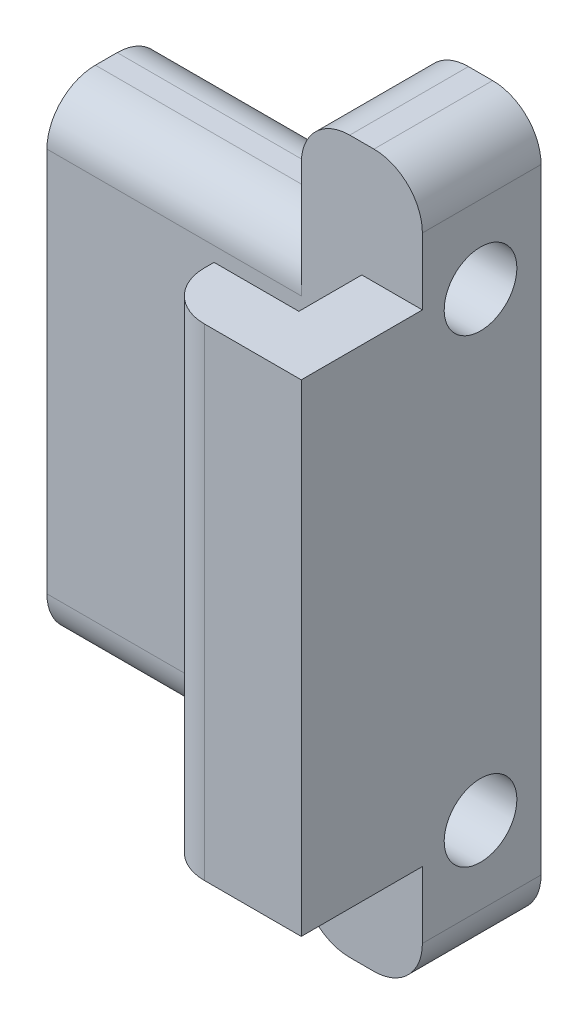
ISO-10303-21;
HEADER;
FILE_DESCRIPTION(('STEP AP214'),'2;1');
FILE_NAME('part.step','',(''),(''),'','','');
FILE_SCHEMA(('AUTOMOTIVE_DESIGN { 1 0 10303 214 1 1 1 1 }'));
ENDSEC;
DATA;
#1=APPLICATION_CONTEXT('core data for automotive mechanical design processes');
#2=APPLICATION_PROTOCOL_DEFINITION('international standard','automotive_design',2000,#1);
#3=PRODUCT_CONTEXT('',#1,'mechanical');
#4=PRODUCT('Part','Part','',(#3));
#5=PRODUCT_RELATED_PRODUCT_CATEGORY('part','',(#4));
#6=PRODUCT_DEFINITION_FORMATION('','',#4);
#7=PRODUCT_DEFINITION_CONTEXT('part definition',#1,'design');
#8=PRODUCT_DEFINITION('design','',#6,#7);
#9=PRODUCT_DEFINITION_SHAPE('','',#8);
#10=(LENGTH_UNIT() NAMED_UNIT(*) SI_UNIT(.MILLI.,.METRE.));
#11=(NAMED_UNIT(*) PLANE_ANGLE_UNIT() SI_UNIT($,.RADIAN.));
#12=(NAMED_UNIT(*) SI_UNIT($,.STERADIAN.) SOLID_ANGLE_UNIT());
#13=UNCERTAINTY_MEASURE_WITH_UNIT(LENGTH_MEASURE(1.E-05),#10,'distance_accuracy_value','');
#14=(GEOMETRIC_REPRESENTATION_CONTEXT(3) GLOBAL_UNCERTAINTY_ASSIGNED_CONTEXT((#13)) GLOBAL_UNIT_ASSIGNED_CONTEXT((#10,
#11,#12)) REPRESENTATION_CONTEXT('',''));
#15=CARTESIAN_POINT('',(0.,0.,0.));
#16=DIRECTION('',(0.,0.,1.));
#17=DIRECTION('',(1.,0.,0.));
#18=AXIS2_PLACEMENT_3D('',#15,#16,#17);
#19=CARTESIAN_POINT('',(10.5,19.9,4.9));
#20=DIRECTION('',(1.,0.,0.));
#21=DIRECTION('',(0.,0.,-1.));
#22=AXIS2_PLACEMENT_3D('',#19,#20,#21);
#23=PLANE('',#22);
#24=DIRECTION('',(0.,-1.,0.));
#25=VECTOR('',#24,1.);
#26=CARTESIAN_POINT('',(10.5,-4.75,0.));
#27=LINE('',#26,#25);
#28=CARTESIAN_POINT('',(10.5,2.,0.));
#29=VERTEX_POINT('',#28);
#30=CARTESIAN_POINT('',(10.5,-2.75,0.));
#31=VERTEX_POINT('',#30);
#32=EDGE_CURVE('E252',#29,#31,#27,.T.);
#33=ORIENTED_EDGE('',*,*,#32,.T.);
#34=DIRECTION('',(0.,0.,-1.));
#35=VECTOR('',#34,1.);
#36=CARTESIAN_POINT('',(10.5,-2.75,4.9));
#37=LINE('',#36,#35);
#38=CARTESIAN_POINT('',(10.5,-2.75,4.9));
#39=VERTEX_POINT('',#38);
#40=EDGE_CURVE('E371',#31,#39,#37,.F.);
#41=ORIENTED_EDGE('',*,*,#40,.T.);
#42=DIRECTION('',(0.,-1.,0.));
#43=VECTOR('',#42,1.);
#44=CARTESIAN_POINT('',(10.5,-4.75,4.9));
#45=LINE('',#44,#43);
#46=CARTESIAN_POINT('',(10.5,2.,4.9));
#47=VERTEX_POINT('',#46);
#48=EDGE_CURVE('E261',#47,#39,#45,.T.);
#49=ORIENTED_EDGE('',*,*,#48,.F.);
#50=CARTESIAN_POINT('',(10.5,2.,2.9));
#51=DIRECTION('',(1.,0.,0.));
#52=DIRECTION('',(0.,0.,-1.));
#53=AXIS2_PLACEMENT_3D('',#50,#51,#52);
#54=CIRCLE('',#53,2.);
#55=CARTESIAN_POINT('',(10.5,0.,2.9));
#56=VERTEX_POINT('',#55);
#57=EDGE_CURVE('E335',#47,#56,#54,.T.);
#58=ORIENTED_EDGE('',*,*,#57,.T.);
#59=DIRECTION('',(0.,0.,-1.));
#60=VECTOR('',#59,1.);
#61=CARTESIAN_POINT('',(10.5,0.,4.9));
#62=LINE('',#61,#60);
#63=CARTESIAN_POINT('',(10.5,0.,2.));
#64=VERTEX_POINT('',#63);
#65=EDGE_CURVE('E303',#56,#64,#62,.T.);
#66=ORIENTED_EDGE('',*,*,#65,.T.);
#67=CARTESIAN_POINT('',(10.5,2.,2.));
#68=DIRECTION('',(1.,0.,0.));
#69=DIRECTION('',(0.,0.,-1.));
#70=AXIS2_PLACEMENT_3D('',#67,#68,#69);
#71=CIRCLE('',#70,2.);
#72=EDGE_CURVE('E337',#64,#29,#71,.T.);
#73=ORIENTED_EDGE('',*,*,#72,.T.);
#74=EDGE_LOOP('',(#33,#41,#49,#58,#66,#73));
#75=FACE_BOUND('',#74,.T.);
#76=ADVANCED_FACE('F41',(#75),#23,.F.);
#77=DIRECTION('',(0.,-1.,0.));
#78=VECTOR('',#77,1.);
#79=CARTESIAN_POINT('',(10.5,19.9,4.9));
#80=LINE('',#79,#78);
#81=CARTESIAN_POINT('',(10.5,22.65,4.9));
#82=VERTEX_POINT('',#81);
#83=CARTESIAN_POINT('',(10.5,17.9,4.9));
#84=VERTEX_POINT('',#83);
#85=EDGE_CURVE('E274',#82,#84,#80,.T.);
#86=ORIENTED_EDGE('',*,*,#85,.F.);
#87=DIRECTION('',(0.,0.,-1.));
#88=VECTOR('',#87,1.);
#89=CARTESIAN_POINT('',(10.5,22.65,4.9));
#90=LINE('',#89,#88);
#91=CARTESIAN_POINT('',(10.5,22.65,0.));
#92=VERTEX_POINT('',#91);
#93=EDGE_CURVE('E373',#82,#92,#90,.T.);
#94=ORIENTED_EDGE('',*,*,#93,.T.);
#95=DIRECTION('',(0.,-1.,0.));
#96=VECTOR('',#95,1.);
#97=CARTESIAN_POINT('',(10.5,19.9,0.));
#98=LINE('',#97,#96);
#99=CARTESIAN_POINT('',(10.5,17.9,0.));
#100=VERTEX_POINT('',#99);
#101=EDGE_CURVE('E291',#92,#100,#98,.T.);
#102=ORIENTED_EDGE('',*,*,#101,.T.);
#103=CARTESIAN_POINT('',(10.5,17.9,2.));
#104=DIRECTION('',(1.,0.,0.));
#105=DIRECTION('',(0.,0.,-1.));
#106=AXIS2_PLACEMENT_3D('',#103,#104,#105);
#107=CIRCLE('',#106,2.);
#108=CARTESIAN_POINT('',(10.5,19.9,2.));
#109=VERTEX_POINT('',#108);
#110=EDGE_CURVE('E340',#100,#109,#107,.T.);
#111=ORIENTED_EDGE('',*,*,#110,.T.);
#112=DIRECTION('',(0.,0.,-1.));
#113=VECTOR('',#112,1.);
#114=CARTESIAN_POINT('',(10.5,19.9,4.9));
#115=LINE('',#114,#113);
#116=CARTESIAN_POINT('',(10.5,19.9,2.9));
#117=VERTEX_POINT('',#116);
#118=EDGE_CURVE('E300',#117,#109,#115,.T.);
#119=ORIENTED_EDGE('',*,*,#118,.F.);
#120=CARTESIAN_POINT('',(10.5,17.9,2.9));
#121=DIRECTION('',(1.,0.,0.));
#122=DIRECTION('',(0.,0.,-1.));
#123=AXIS2_PLACEMENT_3D('',#120,#121,#122);
#124=CIRCLE('',#123,2.);
#125=EDGE_CURVE('E342',#117,#84,#124,.T.);
#126=ORIENTED_EDGE('',*,*,#125,.T.);
#127=EDGE_LOOP('',(#86,#94,#102,#111,#119,#126));
#128=FACE_BOUND('',#127,.T.);
#129=ADVANCED_FACE('F399',(#128),#23,.F.);
#130=CARTESIAN_POINT('',(0.,0.,4.9));
#131=DIRECTION('',(0.,0.,-1.));
#132=DIRECTION('',(-1.,0.,0.));
#133=AXIS2_PLACEMENT_3D('',#130,#131,#132);
#134=PLANE('',#133);
#135=DIRECTION('',(1.,0.,0.));
#136=VECTOR('',#135,1.);
#137=CARTESIAN_POINT('',(15.5,-4.75,4.9));
#138=LINE('',#137,#136);
#139=CARTESIAN_POINT('',(12.5,-4.75,4.9));
#140=VERTEX_POINT('',#139);
#141=CARTESIAN_POINT('',(13.5,-4.75,4.9));
#142=VERTEX_POINT('',#141);
#143=EDGE_CURVE('E264',#140,#142,#138,.T.);
#144=ORIENTED_EDGE('',*,*,#143,.T.);
#145=CARTESIAN_POINT('',(13.5,-2.75,4.9));
#146=DIRECTION('',(0.,0.,-1.));
#147=DIRECTION('',(-1.,0.,0.));
#148=AXIS2_PLACEMENT_3D('',#145,#146,#147);
#149=CIRCLE('',#148,2.);
#150=CARTESIAN_POINT('',(15.5,-2.75,4.9));
#151=VERTEX_POINT('',#150);
#152=EDGE_CURVE('E369',#142,#151,#149,.F.);
#153=ORIENTED_EDGE('',*,*,#152,.T.);
#154=DIRECTION('',(0.,1.,0.));
#155=VECTOR('',#154,1.);
#156=CARTESIAN_POINT('',(15.5,24.65,4.9));
#157=LINE('',#156,#155);
#158=CARTESIAN_POINT('',(15.5,0.,4.9));
#159=VERTEX_POINT('',#158);
#160=EDGE_CURVE('E269',#151,#159,#157,.T.);
#161=ORIENTED_EDGE('',*,*,#160,.T.);
#162=DIRECTION('',(1.,0.,0.));
#163=VECTOR('',#162,1.);
#164=CARTESIAN_POINT('',(10.5,0.,4.9));
#165=LINE('',#164,#163);
#166=CARTESIAN_POINT('',(13.,0.,4.9));
#167=VERTEX_POINT('',#166);
#168=EDGE_CURVE('E231',#167,#159,#165,.T.);
#169=ORIENTED_EDGE('',*,*,#168,.F.);
#170=DIRECTION('',(0.,1.,0.));
#171=VECTOR('',#170,1.);
#172=CARTESIAN_POINT('',(13.,-4.75,4.9));
#173=LINE('',#172,#171);
#174=CARTESIAN_POINT('',(13.,19.9,4.9));
#175=VERTEX_POINT('',#174);
#176=EDGE_CURVE('E224',#167,#175,#173,.T.);
#177=ORIENTED_EDGE('',*,*,#176,.T.);
#178=DIRECTION('',(-1.,0.,0.));
#179=VECTOR('',#178,1.);
#180=CARTESIAN_POINT('',(10.5,19.9,4.9));
#181=LINE('',#180,#179);
#182=CARTESIAN_POINT('',(15.5,19.9,4.9));
#183=VERTEX_POINT('',#182);
#184=EDGE_CURVE('E235',#183,#175,#181,.T.);
#185=ORIENTED_EDGE('',*,*,#184,.F.);
#186=CARTESIAN_POINT('',(15.5,22.65,4.9));
#187=VERTEX_POINT('',#186);
#188=EDGE_CURVE('E268',#183,#187,#157,.T.);
#189=ORIENTED_EDGE('',*,*,#188,.T.);
#190=CARTESIAN_POINT('',(13.5,22.65,4.9));
#191=DIRECTION('',(0.,0.,-1.));
#192=DIRECTION('',(-1.,0.,0.));
#193=AXIS2_PLACEMENT_3D('',#190,#191,#192);
#194=CIRCLE('',#193,2.);
#195=CARTESIAN_POINT('',(13.5,24.65,4.9));
#196=VERTEX_POINT('',#195);
#197=EDGE_CURVE('E363',#187,#196,#194,.F.);
#198=ORIENTED_EDGE('',*,*,#197,.T.);
#199=DIRECTION('',(-1.,0.,0.));
#200=VECTOR('',#199,1.);
#201=CARTESIAN_POINT('',(10.5,24.65,4.9));
#202=LINE('',#201,#200);
#203=CARTESIAN_POINT('',(12.5,24.65,4.9));
#204=VERTEX_POINT('',#203);
#205=EDGE_CURVE('E271',#196,#204,#202,.T.);
#206=ORIENTED_EDGE('',*,*,#205,.T.);
#207=CARTESIAN_POINT('',(12.5,22.65,4.9));
#208=DIRECTION('',(0.,0.,-1.));
#209=DIRECTION('',(-1.,0.,0.));
#210=AXIS2_PLACEMENT_3D('',#207,#208,#209);
#211=CIRCLE('',#210,2.);
#212=EDGE_CURVE('E365',#204,#82,#211,.F.);
#213=ORIENTED_EDGE('',*,*,#212,.T.);
#214=ORIENTED_EDGE('',*,*,#85,.T.);
#215=DIRECTION('',(-1.,0.,0.));
#216=VECTOR('',#215,1.);
#217=CARTESIAN_POINT('',(0.,17.9,4.9));
#218=LINE('',#217,#216);
#219=CARTESIAN_POINT('',(0.,17.9,4.9));
#220=VERTEX_POINT('',#219);
#221=EDGE_CURVE('E306',#84,#220,#218,.T.);
#222=ORIENTED_EDGE('',*,*,#221,.T.);
#223=DIRECTION('',(0.,-1.,0.));
#224=VECTOR('',#223,1.);
#225=CARTESIAN_POINT('',(0.,0.,4.9));
#226=LINE('',#225,#224);
#227=CARTESIAN_POINT('',(0.,2.,4.9));
#228=VERTEX_POINT('',#227);
#229=EDGE_CURVE('E276',#220,#228,#226,.T.);
#230=ORIENTED_EDGE('',*,*,#229,.T.);
#231=DIRECTION('',(1.,0.,0.));
#232=VECTOR('',#231,1.);
#233=CARTESIAN_POINT('',(0.,2.,4.9));
#234=LINE('',#233,#232);
#235=EDGE_CURVE('E309',#228,#47,#234,.T.);
#236=ORIENTED_EDGE('',*,*,#235,.T.);
#237=ORIENTED_EDGE('',*,*,#48,.T.);
#238=CARTESIAN_POINT('',(12.5,-2.75,4.9));
#239=DIRECTION('',(0.,0.,-1.));
#240=DIRECTION('',(-1.,0.,0.));
#241=AXIS2_PLACEMENT_3D('',#238,#239,#240);
#242=CIRCLE('',#241,2.);
#243=EDGE_CURVE('E367',#39,#140,#242,.F.);
#244=ORIENTED_EDGE('',*,*,#243,.T.);
#245=EDGE_LOOP('',(#144,#153,#161,#169,#177,#185,#189,#198,#206,#213,#214,#222,#230,#236,#237,#244));
#246=FACE_BOUND('',#245,.T.);
#247=ADVANCED_FACE('F391',(#246),#134,.F.);
#248=CARTESIAN_POINT('',(10.5,0.,4.9));
#249=DIRECTION('',(0.,1.,0.));
#250=DIRECTION('',(-1.,0.,0.));
#251=AXIS2_PLACEMENT_3D('',#248,#249,#250);
#252=PLANE('',#251);
#253=ORIENTED_EDGE('',*,*,#65,.F.);
#254=DIRECTION('',(1.,0.,0.));
#255=VECTOR('',#254,1.);
#256=CARTESIAN_POINT('',(10.5,0.,2.9));
#257=LINE('',#256,#255);
#258=CARTESIAN_POINT('',(0.,0.,2.9));
#259=VERTEX_POINT('',#258);
#260=EDGE_CURVE('E315',#56,#259,#257,.F.);
#261=ORIENTED_EDGE('',*,*,#260,.T.);
#262=DIRECTION('',(0.,0.,-1.));
#263=VECTOR('',#262,1.);
#264=CARTESIAN_POINT('',(0.,0.,4.9));
#265=LINE('',#264,#263);
#266=CARTESIAN_POINT('',(0.,0.,2.));
#267=VERTEX_POINT('',#266);
#268=EDGE_CURVE('E279',#259,#267,#265,.T.);
#269=ORIENTED_EDGE('',*,*,#268,.T.);
#270=DIRECTION('',(1.,0.,0.));
#271=VECTOR('',#270,1.);
#272=CARTESIAN_POINT('',(10.5,0.,2.));
#273=LINE('',#272,#271);
#274=EDGE_CURVE('E312',#267,#64,#273,.T.);
#275=ORIENTED_EDGE('',*,*,#274,.T.);
#276=EDGE_LOOP('',(#253,#261,#269,#275));
#277=FACE_BOUND('',#276,.T.);
#278=ADVANCED_FACE('F480',(#277),#252,.F.);
#279=CARTESIAN_POINT('',(15.5,-4.75,4.9));
#280=DIRECTION('',(0.,1.,0.));
#281=DIRECTION('',(-1.,0.,0.));
#282=AXIS2_PLACEMENT_3D('',#279,#280,#281);
#283=PLANE('',#282);
#284=DIRECTION('',(1.,0.,0.));
#285=VECTOR('',#284,1.);
#286=CARTESIAN_POINT('',(15.5,-4.75,0.));
#287=LINE('',#286,#285);
#288=CARTESIAN_POINT('',(12.5,-4.75,0.));
#289=VERTEX_POINT('',#288);
#290=CARTESIAN_POINT('',(13.5,-4.75,0.));
#291=VERTEX_POINT('',#290);
#292=EDGE_CURVE('E282',#289,#291,#287,.T.);
#293=ORIENTED_EDGE('',*,*,#292,.T.);
#294=DIRECTION('',(0.,0.,-1.));
#295=VECTOR('',#294,1.);
#296=CARTESIAN_POINT('',(13.5,-4.75,4.9));
#297=LINE('',#296,#295);
#298=EDGE_CURVE('E361',#291,#142,#297,.F.);
#299=ORIENTED_EDGE('',*,*,#298,.T.);
#300=ORIENTED_EDGE('',*,*,#143,.F.);
#301=DIRECTION('',(0.,0.,-1.));
#302=VECTOR('',#301,1.);
#303=CARTESIAN_POINT('',(12.5,-4.75,4.9));
#304=LINE('',#303,#302);
#305=EDGE_CURVE('E358',#140,#289,#304,.T.);
#306=ORIENTED_EDGE('',*,*,#305,.T.);
#307=EDGE_LOOP('',(#293,#299,#300,#306));
#308=FACE_BOUND('',#307,.T.);
#309=ADVANCED_FACE('F437',(#308),#283,.F.);
#310=CARTESIAN_POINT('',(15.5,24.65,4.9));
#311=DIRECTION('',(-1.,0.,0.));
#312=DIRECTION('',(0.,-1.,0.));
#313=AXIS2_PLACEMENT_3D('',#310,#311,#312);
#314=PLANE('',#313);
#315=CARTESIAN_POINT('',(15.5,19.45,2.5));
#316=DIRECTION('',(1.,0.,0.));
#317=DIRECTION('',(0.,1.,0.));
#318=AXIS2_PLACEMENT_3D('',#315,#316,#317);
#319=CIRCLE('',#318,1.5);
#320=CARTESIAN_POINT('',(15.5,20.95,2.5));
#321=VERTEX_POINT('',#320);
#322=EDGE_CURVE('E253',#321,#321,#319,.T.);
#323=ORIENTED_EDGE('',*,*,#322,.F.);
#324=EDGE_LOOP('',(#323));
#325=FACE_BOUND('',#324,.T.);
#326=CARTESIAN_POINT('',(15.5,0.450000000000001,2.5));
#327=DIRECTION('',(1.,0.,0.));
#328=DIRECTION('',(0.,-1.,0.));
#329=AXIS2_PLACEMENT_3D('',#326,#327,#328);
#330=CIRCLE('',#329,1.5);
#331=CARTESIAN_POINT('',(15.5,-1.05,2.5));
#332=VERTEX_POINT('',#331);
#333=EDGE_CURVE('E256',#332,#332,#330,.T.);
#334=ORIENTED_EDGE('',*,*,#333,.F.);
#335=EDGE_LOOP('',(#334));
#336=FACE_BOUND('',#335,.T.);
#337=ORIENTED_EDGE('',*,*,#160,.F.);
#338=DIRECTION('',(0.,0.,-1.));
#339=VECTOR('',#338,1.);
#340=CARTESIAN_POINT('',(15.5,-2.75,4.9));
#341=LINE('',#340,#339);
#342=CARTESIAN_POINT('',(15.5,-2.75,0.));
#343=VERTEX_POINT('',#342);
#344=EDGE_CURVE('E347',#151,#343,#341,.T.);
#345=ORIENTED_EDGE('',*,*,#344,.T.);
#346=DIRECTION('',(0.,1.,0.));
#347=VECTOR('',#346,1.);
#348=CARTESIAN_POINT('',(15.5,24.65,0.));
#349=LINE('',#348,#347);
#350=CARTESIAN_POINT('',(15.5,22.65,0.));
#351=VERTEX_POINT('',#350);
#352=EDGE_CURVE('E285',#343,#351,#349,.T.);
#353=ORIENTED_EDGE('',*,*,#352,.T.);
#354=DIRECTION('',(0.,0.,-1.));
#355=VECTOR('',#354,1.);
#356=CARTESIAN_POINT('',(15.5,22.65,4.9));
#357=LINE('',#356,#355);
#358=EDGE_CURVE('E345',#351,#187,#357,.F.);
#359=ORIENTED_EDGE('',*,*,#358,.T.);
#360=ORIENTED_EDGE('',*,*,#188,.F.);
#361=DIRECTION('',(0.,0.,-1.));
#362=VECTOR('',#361,1.);
#363=CARTESIAN_POINT('',(15.5,19.9,9.9));
#364=LINE('',#363,#362);
#365=CARTESIAN_POINT('',(15.5,19.9,9.9));
#366=VERTEX_POINT('',#365);
#367=EDGE_CURVE('E239',#366,#183,#364,.T.);
#368=ORIENTED_EDGE('',*,*,#367,.F.);
#369=DIRECTION('',(0.,1.,0.));
#370=VECTOR('',#369,1.);
#371=CARTESIAN_POINT('',(15.5,19.9,9.9));
#372=LINE('',#371,#370);
#373=CARTESIAN_POINT('',(15.5,0.,9.9));
#374=VERTEX_POINT('',#373);
#375=EDGE_CURVE('E234',#374,#366,#372,.T.);
#376=ORIENTED_EDGE('',*,*,#375,.F.);
#377=DIRECTION('',(0.,0.,-1.));
#378=VECTOR('',#377,1.);
#379=CARTESIAN_POINT('',(15.5,0.,9.9));
#380=LINE('',#379,#378);
#381=EDGE_CURVE('E245',#374,#159,#380,.T.);
#382=ORIENTED_EDGE('',*,*,#381,.T.);
#383=EDGE_LOOP('',(#337,#345,#353,#359,#360,#368,#376,#382));
#384=FACE_BOUND('',#383,.T.);
#385=ADVANCED_FACE('F445',(#325,#336,#384),#314,.F.);
#386=CARTESIAN_POINT('',(10.5,24.65,4.9));
#387=DIRECTION('',(0.,-1.,0.));
#388=DIRECTION('',(0.,0.,-1.));
#389=AXIS2_PLACEMENT_3D('',#386,#387,#388);
#390=PLANE('',#389);
#391=DIRECTION('',(-1.,0.,0.));
#392=VECTOR('',#391,1.);
#393=CARTESIAN_POINT('',(10.5,24.65,0.));
#394=LINE('',#393,#392);
#395=CARTESIAN_POINT('',(13.5,24.65,0.));
#396=VERTEX_POINT('',#395);
#397=CARTESIAN_POINT('',(12.5,24.65,0.));
#398=VERTEX_POINT('',#397);
#399=EDGE_CURVE('E288',#396,#398,#394,.T.);
#400=ORIENTED_EDGE('',*,*,#399,.T.);
#401=DIRECTION('',(0.,0.,-1.));
#402=VECTOR('',#401,1.);
#403=CARTESIAN_POINT('',(12.5,24.65,4.9));
#404=LINE('',#403,#402);
#405=EDGE_CURVE('E379',#398,#204,#404,.F.);
#406=ORIENTED_EDGE('',*,*,#405,.T.);
#407=ORIENTED_EDGE('',*,*,#205,.F.);
#408=DIRECTION('',(0.,0.,-1.));
#409=VECTOR('',#408,1.);
#410=CARTESIAN_POINT('',(13.5,24.65,4.9));
#411=LINE('',#410,#409);
#412=EDGE_CURVE('E376',#196,#396,#411,.T.);
#413=ORIENTED_EDGE('',*,*,#412,.T.);
#414=EDGE_LOOP('',(#400,#406,#407,#413));
#415=FACE_BOUND('',#414,.T.);
#416=ADVANCED_FACE('F385',(#415),#390,.F.);
#417=CARTESIAN_POINT('',(0.,19.9,4.9));
#418=DIRECTION('',(0.,-1.,0.));
#419=DIRECTION('',(0.,0.,-1.));
#420=AXIS2_PLACEMENT_3D('',#417,#418,#419);
#421=PLANE('',#420);
#422=ORIENTED_EDGE('',*,*,#118,.T.);
#423=DIRECTION('',(-1.,0.,0.));
#424=VECTOR('',#423,1.);
#425=CARTESIAN_POINT('',(0.,19.9,2.));
#426=LINE('',#425,#424);
#427=CARTESIAN_POINT('',(0.,19.9,2.));
#428=VERTEX_POINT('',#427);
#429=EDGE_CURVE('E332',#109,#428,#426,.T.);
#430=ORIENTED_EDGE('',*,*,#429,.T.);
#431=DIRECTION('',(0.,0.,-1.));
#432=VECTOR('',#431,1.);
#433=CARTESIAN_POINT('',(0.,19.9,4.9));
#434=LINE('',#433,#432);
#435=CARTESIAN_POINT('',(0.,19.9,2.9));
#436=VERTEX_POINT('',#435);
#437=EDGE_CURVE('E297',#436,#428,#434,.T.);
#438=ORIENTED_EDGE('',*,*,#437,.F.);
#439=DIRECTION('',(-1.,0.,0.));
#440=VECTOR('',#439,1.);
#441=CARTESIAN_POINT('',(0.,19.9,2.9));
#442=LINE('',#441,#440);
#443=EDGE_CURVE('E330',#436,#117,#442,.F.);
#444=ORIENTED_EDGE('',*,*,#443,.T.);
#445=EDGE_LOOP('',(#422,#430,#438,#444));
#446=FACE_BOUND('',#445,.T.);
#447=ADVANCED_FACE('F412',(#446),#421,.F.);
#448=CARTESIAN_POINT('',(0.,0.,4.9));
#449=DIRECTION('',(1.,0.,0.));
#450=DIRECTION('',(0.,0.,-1.));
#451=AXIS2_PLACEMENT_3D('',#448,#449,#450);
#452=PLANE('',#451);
#453=ORIENTED_EDGE('',*,*,#268,.F.);
#454=CARTESIAN_POINT('',(0.,2.,2.9));
#455=DIRECTION('',(1.,0.,0.));
#456=DIRECTION('',(0.,0.,-1.));
#457=AXIS2_PLACEMENT_3D('',#454,#455,#456);
#458=CIRCLE('',#457,2.);
#459=EDGE_CURVE('E323',#259,#228,#458,.F.);
#460=ORIENTED_EDGE('',*,*,#459,.T.);
#461=ORIENTED_EDGE('',*,*,#229,.F.);
#462=CARTESIAN_POINT('',(0.,17.9,2.9));
#463=DIRECTION('',(1.,0.,0.));
#464=DIRECTION('',(0.,0.,-1.));
#465=AXIS2_PLACEMENT_3D('',#462,#463,#464);
#466=CIRCLE('',#465,2.);
#467=EDGE_CURVE('E317',#220,#436,#466,.F.);
#468=ORIENTED_EDGE('',*,*,#467,.T.);
#469=ORIENTED_EDGE('',*,*,#437,.T.);
#470=CARTESIAN_POINT('',(0.,17.9,2.));
#471=DIRECTION('',(1.,0.,0.));
#472=DIRECTION('',(0.,0.,-1.));
#473=AXIS2_PLACEMENT_3D('',#470,#471,#472);
#474=CIRCLE('',#473,2.);
#475=CARTESIAN_POINT('',(0.,17.9,0.));
#476=VERTEX_POINT('',#475);
#477=EDGE_CURVE('E319',#428,#476,#474,.F.);
#478=ORIENTED_EDGE('',*,*,#477,.T.);
#479=DIRECTION('',(0.,-1.,0.));
#480=VECTOR('',#479,1.);
#481=CARTESIAN_POINT('',(0.,0.,0.));
#482=LINE('',#481,#480);
#483=CARTESIAN_POINT('',(0.,2.,0.));
#484=VERTEX_POINT('',#483);
#485=EDGE_CURVE('E265',#476,#484,#482,.T.);
#486=ORIENTED_EDGE('',*,*,#485,.T.);
#487=CARTESIAN_POINT('',(0.,2.,2.));
#488=DIRECTION('',(1.,0.,0.));
#489=DIRECTION('',(0.,0.,-1.));
#490=AXIS2_PLACEMENT_3D('',#487,#488,#489);
#491=CIRCLE('',#490,2.);
#492=EDGE_CURVE('E321',#484,#267,#491,.F.);
#493=ORIENTED_EDGE('',*,*,#492,.T.);
#494=EDGE_LOOP('',(#453,#460,#461,#468,#469,#478,#486,#493));
#495=FACE_BOUND('',#494,.T.);
#496=ADVANCED_FACE('F422',(#495),#452,.F.);
#497=CARTESIAN_POINT('',(0.,0.,0.));
#498=DIRECTION('',(0.,0.,-1.));
#499=DIRECTION('',(-1.,0.,0.));
#500=AXIS2_PLACEMENT_3D('',#497,#498,#499);
#501=PLANE('',#500);
#502=ORIENTED_EDGE('',*,*,#352,.F.);
#503=CARTESIAN_POINT('',(13.5,-2.75,0.));
#504=DIRECTION('',(0.,0.,-1.));
#505=DIRECTION('',(-1.,0.,0.));
#506=AXIS2_PLACEMENT_3D('',#503,#504,#505);
#507=CIRCLE('',#506,2.);
#508=EDGE_CURVE('E356',#343,#291,#507,.T.);
#509=ORIENTED_EDGE('',*,*,#508,.T.);
#510=ORIENTED_EDGE('',*,*,#292,.F.);
#511=CARTESIAN_POINT('',(12.5,-2.75,0.));
#512=DIRECTION('',(0.,0.,-1.));
#513=DIRECTION('',(-1.,0.,0.));
#514=AXIS2_PLACEMENT_3D('',#511,#512,#513);
#515=CIRCLE('',#514,2.);
#516=EDGE_CURVE('E354',#289,#31,#515,.T.);
#517=ORIENTED_EDGE('',*,*,#516,.T.);
#518=ORIENTED_EDGE('',*,*,#32,.F.);
#519=DIRECTION('',(1.,0.,0.));
#520=VECTOR('',#519,1.);
#521=CARTESIAN_POINT('',(0.,2.,0.));
#522=LINE('',#521,#520);
#523=EDGE_CURVE('E328',#29,#484,#522,.F.);
#524=ORIENTED_EDGE('',*,*,#523,.T.);
#525=ORIENTED_EDGE('',*,*,#485,.F.);
#526=DIRECTION('',(-1.,0.,0.));
#527=VECTOR('',#526,1.);
#528=CARTESIAN_POINT('',(10.5,17.9,0.));
#529=LINE('',#528,#527);
#530=EDGE_CURVE('E325',#476,#100,#529,.F.);
#531=ORIENTED_EDGE('',*,*,#530,.T.);
#532=ORIENTED_EDGE('',*,*,#101,.F.);
#533=CARTESIAN_POINT('',(12.5,22.65,0.));
#534=DIRECTION('',(0.,0.,-1.));
#535=DIRECTION('',(-1.,0.,0.));
#536=AXIS2_PLACEMENT_3D('',#533,#534,#535);
#537=CIRCLE('',#536,2.);
#538=EDGE_CURVE('E352',#92,#398,#537,.T.);
#539=ORIENTED_EDGE('',*,*,#538,.T.);
#540=ORIENTED_EDGE('',*,*,#399,.F.);
#541=CARTESIAN_POINT('',(13.5,22.65,0.));
#542=DIRECTION('',(0.,0.,-1.));
#543=DIRECTION('',(-1.,0.,0.));
#544=AXIS2_PLACEMENT_3D('',#541,#542,#543);
#545=CIRCLE('',#544,2.);
#546=EDGE_CURVE('E350',#396,#351,#545,.T.);
#547=ORIENTED_EDGE('',*,*,#546,.T.);
#548=EDGE_LOOP('',(#502,#509,#510,#517,#518,#524,#525,#531,#532,#539,#540,#547));
#549=FACE_BOUND('',#548,.T.);
#550=ADVANCED_FACE('F402',(#549),#501,.T.);
#551=CARTESIAN_POINT('',(0.,2.,2.9));
#552=DIRECTION('',(1.,0.,0.));
#553=DIRECTION('',(0.,1.,0.));
#554=AXIS2_PLACEMENT_3D('',#551,#552,#553);
#555=CYLINDRICAL_SURFACE('',#554,2.);
#556=ORIENTED_EDGE('',*,*,#459,.F.);
#557=ORIENTED_EDGE('',*,*,#260,.F.);
#558=ORIENTED_EDGE('',*,*,#57,.F.);
#559=ORIENTED_EDGE('',*,*,#235,.F.);
#560=EDGE_LOOP('',(#556,#557,#558,#559));
#561=FACE_BOUND('',#560,.T.);
#562=ADVANCED_FACE('F426',(#561),#555,.T.);
#563=CARTESIAN_POINT('',(10.5,2.,2.));
#564=DIRECTION('',(-1.,0.,0.));
#565=DIRECTION('',(0.,-1.,0.));
#566=AXIS2_PLACEMENT_3D('',#563,#564,#565);
#567=CYLINDRICAL_SURFACE('',#566,2.);
#568=ORIENTED_EDGE('',*,*,#492,.F.);
#569=ORIENTED_EDGE('',*,*,#523,.F.);
#570=ORIENTED_EDGE('',*,*,#72,.F.);
#571=ORIENTED_EDGE('',*,*,#274,.F.);
#572=EDGE_LOOP('',(#568,#569,#570,#571));
#573=FACE_BOUND('',#572,.T.);
#574=ADVANCED_FACE('F486',(#573),#567,.T.);
#575=CARTESIAN_POINT('',(0.,17.9,2.));
#576=DIRECTION('',(1.,0.,0.));
#577=DIRECTION('',(0.,0.,-1.));
#578=AXIS2_PLACEMENT_3D('',#575,#576,#577);
#579=CYLINDRICAL_SURFACE('',#578,2.);
#580=ORIENTED_EDGE('',*,*,#110,.F.);
#581=ORIENTED_EDGE('',*,*,#530,.F.);
#582=ORIENTED_EDGE('',*,*,#477,.F.);
#583=ORIENTED_EDGE('',*,*,#429,.F.);
#584=EDGE_LOOP('',(#580,#581,#582,#583));
#585=FACE_BOUND('',#584,.T.);
#586=ADVANCED_FACE('F408',(#585),#579,.T.);
#587=CARTESIAN_POINT('',(0.,17.9,2.9));
#588=DIRECTION('',(-1.,0.,0.));
#589=DIRECTION('',(0.,0.,1.));
#590=AXIS2_PLACEMENT_3D('',#587,#588,#589);
#591=CYLINDRICAL_SURFACE('',#590,2.);
#592=ORIENTED_EDGE('',*,*,#125,.F.);
#593=ORIENTED_EDGE('',*,*,#443,.F.);
#594=ORIENTED_EDGE('',*,*,#467,.F.);
#595=ORIENTED_EDGE('',*,*,#221,.F.);
#596=EDGE_LOOP('',(#592,#593,#594,#595));
#597=FACE_BOUND('',#596,.T.);
#598=ADVANCED_FACE('F416',(#597),#591,.T.);
#599=CARTESIAN_POINT('',(12.5,0.45,2.5));
#600=DIRECTION('',(1.,0.,0.));
#601=DIRECTION('',(0.,1.,0.));
#602=AXIS2_PLACEMENT_3D('',#599,#600,#601);
#603=CYLINDRICAL_SURFACE('',#602,1.5);
#604=CARTESIAN_POINT('',(12.5,0.45,2.5));
#605=DIRECTION('',(1.,0.,0.));
#606=DIRECTION('',(0.,-1.,0.));
#607=AXIS2_PLACEMENT_3D('',#604,#605,#606);
#608=CIRCLE('',#607,1.5);
#609=CARTESIAN_POINT('',(12.5,-1.05,2.5));
#610=VERTEX_POINT('',#609);
#611=EDGE_CURVE('E248',#610,#610,#608,.T.);
#612=ORIENTED_EDGE('',*,*,#611,.F.);
#613=EDGE_LOOP('',(#612));
#614=FACE_BOUND('',#613,.T.);
#615=ORIENTED_EDGE('',*,*,#333,.T.);
#616=EDGE_LOOP('',(#615));
#617=FACE_BOUND('',#616,.T.);
#618=ADVANCED_FACE('F494',(#614,#617),#603,.F.);
#619=CARTESIAN_POINT('',(12.5,0.45,2.5));
#620=DIRECTION('',(-1.,0.,0.));
#621=DIRECTION('',(0.,-1.,0.));
#622=AXIS2_PLACEMENT_3D('',#619,#620,#621);
#623=PLANE('',#622);
#624=ORIENTED_EDGE('',*,*,#611,.T.);
#625=EDGE_LOOP('',(#624));
#626=FACE_BOUND('',#625,.T.);
#627=ADVANCED_FACE('F631',(#626),#623,.F.);
#628=CARTESIAN_POINT('',(12.5,19.45,2.5));
#629=DIRECTION('',(1.,0.,0.));
#630=DIRECTION('',(0.,1.,0.));
#631=AXIS2_PLACEMENT_3D('',#628,#629,#630);
#632=CYLINDRICAL_SURFACE('',#631,1.5);
#633=CARTESIAN_POINT('',(12.5,19.45,2.5));
#634=DIRECTION('',(1.,0.,0.));
#635=DIRECTION('',(0.,1.,0.));
#636=AXIS2_PLACEMENT_3D('',#633,#634,#635);
#637=CIRCLE('',#636,1.5);
#638=CARTESIAN_POINT('',(12.5,20.95,2.5));
#639=VERTEX_POINT('',#638);
#640=EDGE_CURVE('E249',#639,#639,#637,.T.);
#641=ORIENTED_EDGE('',*,*,#640,.F.);
#642=EDGE_LOOP('',(#641));
#643=FACE_BOUND('',#642,.T.);
#644=ORIENTED_EDGE('',*,*,#322,.T.);
#645=EDGE_LOOP('',(#644));
#646=FACE_BOUND('',#645,.T.);
#647=ADVANCED_FACE('F621',(#643,#646),#632,.F.);
#648=CARTESIAN_POINT('',(12.5,19.45,2.5));
#649=DIRECTION('',(1.,0.,0.));
#650=DIRECTION('',(0.,1.,0.));
#651=AXIS2_PLACEMENT_3D('',#648,#649,#650);
#652=PLANE('',#651);
#653=ORIENTED_EDGE('',*,*,#640,.T.);
#654=EDGE_LOOP('',(#653));
#655=FACE_BOUND('',#654,.T.);
#656=ADVANCED_FACE('F602',(#655),#652,.T.);
#657=CARTESIAN_POINT('',(10.5,0.,9.9));
#658=DIRECTION('',(0.,1.,0.));
#659=DIRECTION('',(0.,0.,1.));
#660=AXIS2_PLACEMENT_3D('',#657,#658,#659);
#661=PLANE('',#660);
#662=DIRECTION('',(1.,0.,0.));
#663=VECTOR('',#662,1.);
#664=CARTESIAN_POINT('',(10.5,0.,9.9));
#665=LINE('',#664,#663);
#666=CARTESIAN_POINT('',(11.5,0.,9.9));
#667=VERTEX_POINT('',#666);
#668=EDGE_CURVE('E232',#667,#374,#665,.T.);
#669=ORIENTED_EDGE('',*,*,#668,.F.);
#670=CARTESIAN_POINT('',(11.5,0.,7.9));
#671=DIRECTION('',(0.,1.,0.));
#672=DIRECTION('',(0.,0.,1.));
#673=AXIS2_PLACEMENT_3D('',#670,#671,#672);
#674=CIRCLE('',#673,2.);
#675=CARTESIAN_POINT('',(9.5,0.,7.9));
#676=VERTEX_POINT('',#675);
#677=EDGE_CURVE('E11',#667,#676,#674,.F.);
#678=ORIENTED_EDGE('',*,*,#677,.T.);
#679=DIRECTION('',(0.,0.,1.));
#680=VECTOR('',#679,1.);
#681=CARTESIAN_POINT('',(9.5,0.,9.9));
#682=LINE('',#681,#680);
#683=CARTESIAN_POINT('',(9.5,0.,7.5));
#684=VERTEX_POINT('',#683);
#685=EDGE_CURVE('E214',#684,#676,#682,.T.);
#686=ORIENTED_EDGE('',*,*,#685,.F.);
#687=DIRECTION('',(1.,0.,0.));
#688=VECTOR('',#687,1.);
#689=CARTESIAN_POINT('',(10.5,0.,7.5));
#690=LINE('',#689,#688);
#691=CARTESIAN_POINT('',(13.,0.,7.5));
#692=VERTEX_POINT('',#691);
#693=EDGE_CURVE('E218',#684,#692,#690,.T.);
#694=ORIENTED_EDGE('',*,*,#693,.T.);
#695=DIRECTION('',(0.,0.,-1.));
#696=VECTOR('',#695,1.);
#697=CARTESIAN_POINT('',(13.,0.,9.9));
#698=LINE('',#697,#696);
#699=EDGE_CURVE('E228',#692,#167,#698,.T.);
#700=ORIENTED_EDGE('',*,*,#699,.T.);
#701=ORIENTED_EDGE('',*,*,#168,.T.);
#702=ORIENTED_EDGE('',*,*,#381,.F.);
#703=EDGE_LOOP('',(#669,#678,#686,#694,#700,#701,#702));
#704=FACE_BOUND('',#703,.T.);
#705=ADVANCED_FACE('F451',(#704),#661,.F.);
#706=CARTESIAN_POINT('',(10.5,19.9,9.9));
#707=DIRECTION('',(0.,-1.,0.));
#708=DIRECTION('',(0.,0.,-1.));
#709=AXIS2_PLACEMENT_3D('',#706,#707,#708);
#710=PLANE('',#709);
#711=DIRECTION('',(0.,0.,-1.));
#712=VECTOR('',#711,1.);
#713=CARTESIAN_POINT('',(9.5,19.9,9.9));
#714=LINE('',#713,#712);
#715=CARTESIAN_POINT('',(9.5,19.9,7.9));
#716=VERTEX_POINT('',#715);
#717=CARTESIAN_POINT('',(9.5,19.9,7.5));
#718=VERTEX_POINT('',#717);
#719=EDGE_CURVE('E195',#716,#718,#714,.T.);
#720=ORIENTED_EDGE('',*,*,#719,.F.);
#721=CARTESIAN_POINT('',(11.5,19.9,7.9));
#722=DIRECTION('',(0.,-1.,0.));
#723=DIRECTION('',(0.,0.,-1.));
#724=AXIS2_PLACEMENT_3D('',#721,#722,#723);
#725=CIRCLE('',#724,2.);
#726=CARTESIAN_POINT('',(11.5,19.9,9.9));
#727=VERTEX_POINT('',#726);
#728=EDGE_CURVE('E63',#716,#727,#725,.F.);
#729=ORIENTED_EDGE('',*,*,#728,.T.);
#730=DIRECTION('',(-1.,0.,0.));
#731=VECTOR('',#730,1.);
#732=CARTESIAN_POINT('',(10.5,19.9,9.9));
#733=LINE('',#732,#731);
#734=EDGE_CURVE('E237',#366,#727,#733,.T.);
#735=ORIENTED_EDGE('',*,*,#734,.F.);
#736=ORIENTED_EDGE('',*,*,#367,.T.);
#737=ORIENTED_EDGE('',*,*,#184,.T.);
#738=DIRECTION('',(0.,0.,-1.));
#739=VECTOR('',#738,1.);
#740=CARTESIAN_POINT('',(13.,19.9,4.9));
#741=LINE('',#740,#739);
#742=CARTESIAN_POINT('',(13.,19.9,7.5));
#743=VERTEX_POINT('',#742);
#744=EDGE_CURVE('E211',#743,#175,#741,.T.);
#745=ORIENTED_EDGE('',*,*,#744,.F.);
#746=DIRECTION('',(1.,0.,0.));
#747=VECTOR('',#746,1.);
#748=CARTESIAN_POINT('',(10.5,19.9,7.5));
#749=LINE('',#748,#747);
#750=EDGE_CURVE('E207',#718,#743,#749,.T.);
#751=ORIENTED_EDGE('',*,*,#750,.F.);
#752=EDGE_LOOP('',(#720,#729,#735,#736,#737,#745,#751));
#753=FACE_BOUND('',#752,.T.);
#754=ADVANCED_FACE('F208',(#753),#710,.F.);
#755=CARTESIAN_POINT('',(0.,0.,9.9));
#756=DIRECTION('',(0.,0.,1.));
#757=DIRECTION('',(1.,0.,0.));
#758=AXIS2_PLACEMENT_3D('',#755,#756,#757);
#759=PLANE('',#758);
#760=ORIENTED_EDGE('',*,*,#734,.T.);
#761=DIRECTION('',(0.,1.,0.));
#762=VECTOR('',#761,1.);
#763=CARTESIAN_POINT('',(11.5,0.,9.9));
#764=LINE('',#763,#762);
#765=EDGE_CURVE('E49',#727,#667,#764,.F.);
#766=ORIENTED_EDGE('',*,*,#765,.T.);
#767=ORIENTED_EDGE('',*,*,#668,.T.);
#768=ORIENTED_EDGE('',*,*,#375,.T.);
#769=EDGE_LOOP('',(#760,#766,#767,#768));
#770=FACE_BOUND('',#769,.T.);
#771=ADVANCED_FACE('F456',(#770),#759,.T.);
#772=CARTESIAN_POINT('',(13.,-4.75,4.9));
#773=DIRECTION('',(1.,0.,0.));
#774=DIRECTION('',(0.,0.,-1.));
#775=AXIS2_PLACEMENT_3D('',#772,#773,#774);
#776=PLANE('',#775);
#777=DIRECTION('',(0.,1.,0.));
#778=VECTOR('',#777,1.);
#779=CARTESIAN_POINT('',(13.,-4.75,7.5));
#780=LINE('',#779,#778);
#781=EDGE_CURVE('E223',#692,#743,#780,.T.);
#782=ORIENTED_EDGE('',*,*,#781,.T.);
#783=ORIENTED_EDGE('',*,*,#744,.T.);
#784=ORIENTED_EDGE('',*,*,#176,.F.);
#785=ORIENTED_EDGE('',*,*,#699,.F.);
#786=EDGE_LOOP('',(#782,#783,#784,#785));
#787=FACE_BOUND('',#786,.T.);
#788=ADVANCED_FACE('F453',(#787),#776,.F.);
#789=CARTESIAN_POINT('',(10.5,-4.75,7.5));
#790=DIRECTION('',(0.,0.,1.));
#791=DIRECTION('',(1.,0.,0.));
#792=AXIS2_PLACEMENT_3D('',#789,#790,#791);
#793=PLANE('',#792);
#794=ORIENTED_EDGE('',*,*,#693,.F.);
#795=DIRECTION('',(0.,-1.,0.));
#796=VECTOR('',#795,1.);
#797=CARTESIAN_POINT('',(9.5,19.9,7.5));
#798=LINE('',#797,#796);
#799=EDGE_CURVE('E200',#718,#684,#798,.T.);
#800=ORIENTED_EDGE('',*,*,#799,.F.);
#801=ORIENTED_EDGE('',*,*,#750,.T.);
#802=ORIENTED_EDGE('',*,*,#781,.F.);
#803=EDGE_LOOP('',(#794,#800,#801,#802));
#804=FACE_BOUND('',#803,.T.);
#805=ADVANCED_FACE('F216',(#804),#793,.F.);
#806=CARTESIAN_POINT('',(13.5,-2.75,4.9));
#807=DIRECTION('',(0.,0.,-1.));
#808=DIRECTION('',(-1.,0.,0.));
#809=AXIS2_PLACEMENT_3D('',#806,#807,#808);
#810=CYLINDRICAL_SURFACE('',#809,2.);
#811=ORIENTED_EDGE('',*,*,#152,.F.);
#812=ORIENTED_EDGE('',*,*,#298,.F.);
#813=ORIENTED_EDGE('',*,*,#508,.F.);
#814=ORIENTED_EDGE('',*,*,#344,.F.);
#815=EDGE_LOOP('',(#811,#812,#813,#814));
#816=FACE_BOUND('',#815,.T.);
#817=ADVANCED_FACE('F442',(#816),#810,.T.);
#818=CARTESIAN_POINT('',(12.5,-2.75,4.9));
#819=DIRECTION('',(0.,0.,-1.));
#820=DIRECTION('',(-1.,0.,0.));
#821=AXIS2_PLACEMENT_3D('',#818,#819,#820);
#822=CYLINDRICAL_SURFACE('',#821,2.);
#823=ORIENTED_EDGE('',*,*,#243,.F.);
#824=ORIENTED_EDGE('',*,*,#40,.F.);
#825=ORIENTED_EDGE('',*,*,#516,.F.);
#826=ORIENTED_EDGE('',*,*,#305,.F.);
#827=EDGE_LOOP('',(#823,#824,#825,#826));
#828=FACE_BOUND('',#827,.T.);
#829=ADVANCED_FACE('F434',(#828),#822,.T.);
#830=CARTESIAN_POINT('',(12.5,22.65,4.9));
#831=DIRECTION('',(0.,0.,-1.));
#832=DIRECTION('',(-1.,0.,0.));
#833=AXIS2_PLACEMENT_3D('',#830,#831,#832);
#834=CYLINDRICAL_SURFACE('',#833,2.);
#835=ORIENTED_EDGE('',*,*,#212,.F.);
#836=ORIENTED_EDGE('',*,*,#405,.F.);
#837=ORIENTED_EDGE('',*,*,#538,.F.);
#838=ORIENTED_EDGE('',*,*,#93,.F.);
#839=EDGE_LOOP('',(#835,#836,#837,#838));
#840=FACE_BOUND('',#839,.T.);
#841=ADVANCED_FACE('F396',(#840),#834,.T.);
#842=CARTESIAN_POINT('',(13.5,22.65,4.9));
#843=DIRECTION('',(0.,0.,-1.));
#844=DIRECTION('',(-1.,0.,0.));
#845=AXIS2_PLACEMENT_3D('',#842,#843,#844);
#846=CYLINDRICAL_SURFACE('',#845,2.);
#847=ORIENTED_EDGE('',*,*,#197,.F.);
#848=ORIENTED_EDGE('',*,*,#358,.F.);
#849=ORIENTED_EDGE('',*,*,#546,.F.);
#850=ORIENTED_EDGE('',*,*,#412,.F.);
#851=EDGE_LOOP('',(#847,#848,#849,#850));
#852=FACE_BOUND('',#851,.T.);
#853=ADVANCED_FACE('F463',(#852),#846,.T.);
#854=CARTESIAN_POINT('',(9.5,0.,0.));
#855=DIRECTION('',(1.,0.,0.));
#856=DIRECTION('',(0.,0.,-1.));
#857=AXIS2_PLACEMENT_3D('',#854,#855,#856);
#858=PLANE('',#857);
#859=ORIENTED_EDGE('',*,*,#685,.T.);
#860=DIRECTION('',(0.,1.,0.));
#861=VECTOR('',#860,1.);
#862=CARTESIAN_POINT('',(9.5,19.9,7.9));
#863=LINE('',#862,#861);
#864=EDGE_CURVE('E203',#676,#716,#863,.T.);
#865=ORIENTED_EDGE('',*,*,#864,.T.);
#866=ORIENTED_EDGE('',*,*,#719,.T.);
#867=ORIENTED_EDGE('',*,*,#799,.T.);
#868=EDGE_LOOP('',(#859,#865,#866,#867));
#869=FACE_BOUND('',#868,.T.);
#870=ADVANCED_FACE('F198',(#869),#858,.F.);
#871=CARTESIAN_POINT('',(11.5,0.,7.9));
#872=DIRECTION('',(0.,-1.,0.));
#873=DIRECTION('',(0.,0.,-1.));
#874=AXIS2_PLACEMENT_3D('',#871,#872,#873);
#875=CYLINDRICAL_SURFACE('',#874,2.);
#876=ORIENTED_EDGE('',*,*,#677,.F.);
#877=ORIENTED_EDGE('',*,*,#765,.F.);
#878=ORIENTED_EDGE('',*,*,#728,.F.);
#879=ORIENTED_EDGE('',*,*,#864,.F.);
#880=EDGE_LOOP('',(#876,#877,#878,#879));
#881=FACE_BOUND('',#880,.T.);
#882=ADVANCED_FACE('F43',(#881),#875,.T.);
#883=CLOSED_SHELL('',(#76,#129,#247,#278,#309,#385,#416,#447,#496,#550,#562,#574,#586,#598,#618,
#627,#647,#656,#705,#754,#771,#788,#805,#817,#829,#841,#853,#870,#882));
#884=MANIFOLD_SOLID_BREP('B2',#883);
#885=ADVANCED_BREP_SHAPE_REPRESENTATION('',(#18,#884),#14);
#886=SHAPE_DEFINITION_REPRESENTATION(#9,#885);
ENDSEC;
END-ISO-10303-21;
